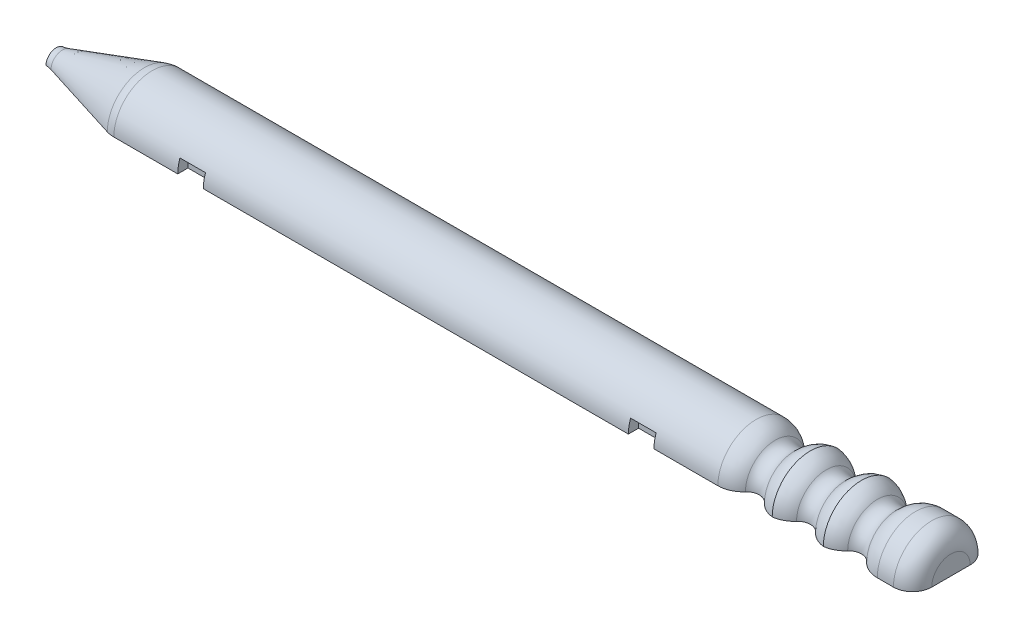
ISO-10303-21;
HEADER;
FILE_DESCRIPTION(('STEP AP214'),'2;1');
FILE_NAME('part.step','',(''),(''),'','','');
FILE_SCHEMA(('AUTOMOTIVE_DESIGN { 1 0 10303 214 1 1 1 1 }'));
ENDSEC;
DATA;
#1=APPLICATION_CONTEXT('core data for automotive mechanical design processes');
#2=APPLICATION_PROTOCOL_DEFINITION('international standard','automotive_design',2000,#1);
#3=PRODUCT_CONTEXT('',#1,'mechanical');
#4=PRODUCT('Part','Part','',(#3));
#5=PRODUCT_RELATED_PRODUCT_CATEGORY('part','',(#4));
#6=PRODUCT_DEFINITION_FORMATION('','',#4);
#7=PRODUCT_DEFINITION_CONTEXT('part definition',#1,'design');
#8=PRODUCT_DEFINITION('design','',#6,#7);
#9=PRODUCT_DEFINITION_SHAPE('','',#8);
#10=(LENGTH_UNIT() NAMED_UNIT(*) SI_UNIT(.MILLI.,.METRE.));
#11=(NAMED_UNIT(*) PLANE_ANGLE_UNIT() SI_UNIT($,.RADIAN.));
#12=(NAMED_UNIT(*) SI_UNIT($,.STERADIAN.) SOLID_ANGLE_UNIT());
#13=UNCERTAINTY_MEASURE_WITH_UNIT(LENGTH_MEASURE(1.E-05),#10,'distance_accuracy_value','');
#14=(GEOMETRIC_REPRESENTATION_CONTEXT(3) GLOBAL_UNCERTAINTY_ASSIGNED_CONTEXT((#13)) GLOBAL_UNIT_ASSIGNED_CONTEXT((#10,
#11,#12)) REPRESENTATION_CONTEXT('',''));
#15=CARTESIAN_POINT('',(0.,0.,0.));
#16=DIRECTION('',(0.,0.,1.));
#17=DIRECTION('',(1.,0.,0.));
#18=AXIS2_PLACEMENT_3D('',#15,#16,#17);
#19=CARTESIAN_POINT('',(0.,0.,1.49999999999999));
#20=DIRECTION('',(-1.,0.,0.));
#21=DIRECTION('',(0.,0.,1.));
#22=AXIS2_PLACEMENT_3D('',#19,#20,#21);
#23=PLANE('',#22);
#24=CARTESIAN_POINT('',(0.,0.,0.));
#25=DIRECTION('',(-1.,0.,0.));
#26=DIRECTION('',(0.,0.,1.));
#27=AXIS2_PLACEMENT_3D('',#24,#25,#26);
#28=CIRCLE('',#27,1.49999999999999);
#29=CARTESIAN_POINT('',(0.,0.,1.49999999999999));
#30=VERTEX_POINT('',#29);
#31=CARTESIAN_POINT('',(0.,0.,-1.49999999999999));
#32=VERTEX_POINT('',#31);
#33=EDGE_CURVE('E465',#30,#32,#28,.T.);
#34=ORIENTED_EDGE('',*,*,#33,.F.);
#35=DIRECTION('',(0.,0.,1.));
#36=VECTOR('',#35,1.);
#37=CARTESIAN_POINT('',(0.,0.,1.49999999999999));
#38=LINE('',#37,#36);
#39=EDGE_CURVE('E276',#32,#30,#38,.T.);
#40=ORIENTED_EDGE('',*,*,#39,.F.);
#41=EDGE_LOOP('',(#34,#40));
#42=FACE_BOUND('',#41,.T.);
#43=ADVANCED_FACE('F37',(#42),#23,.F.);
#44=CARTESIAN_POINT('',(-1.5,0.,0.));
#45=DIRECTION('',(-1.,0.,0.));
#46=DIRECTION('',(0.,0.,1.));
#47=AXIS2_PLACEMENT_3D('',#44,#45,#46);
#48=TOROIDAL_SURFACE('',#47,1.5,1.5);
#49=CARTESIAN_POINT('',(-1.50000000000001,0.,0.));
#50=DIRECTION('',(-1.,0.,0.));
#51=DIRECTION('',(0.,0.,1.));
#52=AXIS2_PLACEMENT_3D('',#49,#50,#51);
#53=CIRCLE('',#52,3.);
#54=CARTESIAN_POINT('',(-1.50000000000001,0.,3.));
#55=VERTEX_POINT('',#54);
#56=CARTESIAN_POINT('',(-1.50000000000001,0.,-3.));
#57=VERTEX_POINT('',#56);
#58=EDGE_CURVE('E468',#55,#57,#53,.T.);
#59=ORIENTED_EDGE('',*,*,#58,.F.);
#60=CARTESIAN_POINT('',(-1.5,0.,1.5));
#61=DIRECTION('',(0.,-1.,0.));
#62=DIRECTION('',(0.,0.,1.));
#63=AXIS2_PLACEMENT_3D('',#60,#61,#62);
#64=CIRCLE('',#63,1.5);
#65=EDGE_CURVE('E496',#30,#55,#64,.T.);
#66=ORIENTED_EDGE('',*,*,#65,.F.);
#67=ORIENTED_EDGE('',*,*,#33,.T.);
#68=CARTESIAN_POINT('',(-1.5,0.,-1.5));
#69=DIRECTION('',(0.,1.,0.));
#70=DIRECTION('',(0.,0.,-1.));
#71=AXIS2_PLACEMENT_3D('',#68,#69,#70);
#72=CIRCLE('',#71,1.5);
#73=EDGE_CURVE('E299',#32,#57,#72,.T.);
#74=ORIENTED_EDGE('',*,*,#73,.T.);
#75=EDGE_LOOP('',(#59,#66,#67,#74));
#76=FACE_BOUND('',#75,.T.);
#77=ADVANCED_FACE('F506',(#76),#48,.T.);
#78=CARTESIAN_POINT('',(0.,0.,0.));
#79=DIRECTION('',(-1.,0.,0.));
#80=DIRECTION('',(0.,0.,1.));
#81=AXIS2_PLACEMENT_3D('',#78,#79,#80);
#82=CYLINDRICAL_SURFACE('',#81,3.);
#83=DIRECTION('',(-1.,0.,0.));
#84=VECTOR('',#83,1.);
#85=CARTESIAN_POINT('',(-4.,0.,-3.));
#86=LINE('',#85,#84);
#87=CARTESIAN_POINT('',(-2.76393202250021,0.,-3.));
#88=VERTEX_POINT('',#87);
#89=EDGE_CURVE('E296',#57,#88,#86,.T.);
#90=ORIENTED_EDGE('',*,*,#89,.T.);
#91=CARTESIAN_POINT('',(-2.76393202250021,0.,0.));
#92=DIRECTION('',(1.,0.,0.));
#93=DIRECTION('',(0.,0.,-1.));
#94=AXIS2_PLACEMENT_3D('',#91,#92,#93);
#95=CIRCLE('',#94,3.);
#96=CARTESIAN_POINT('',(-2.76393202250021,0.,3.));
#97=VERTEX_POINT('',#96);
#98=EDGE_CURVE('E421',#88,#97,#95,.T.);
#99=ORIENTED_EDGE('',*,*,#98,.T.);
#100=DIRECTION('',(-1.,0.,0.));
#101=VECTOR('',#100,1.);
#102=CARTESIAN_POINT('',(-4.,0.,3.));
#103=LINE('',#102,#101);
#104=EDGE_CURVE('E493',#55,#97,#103,.T.);
#105=ORIENTED_EDGE('',*,*,#104,.F.);
#106=ORIENTED_EDGE('',*,*,#58,.T.);
#107=EDGE_LOOP('',(#90,#99,#105,#106));
#108=FACE_BOUND('',#107,.T.);
#109=ADVANCED_FACE('F508',(#108),#82,.T.);
#110=CARTESIAN_POINT('',(-5.,0.,0.));
#111=DIRECTION('',(-1.,0.,0.));
#112=DIRECTION('',(0.,0.,1.));
#113=AXIS2_PLACEMENT_3D('',#110,#111,#112);
#114=TOROIDAL_SURFACE('',#113,3.,1.);
#115=CARTESIAN_POINT('',(-5.,0.,3.));
#116=DIRECTION('',(0.,1.,0.));
#117=DIRECTION('',(0.,0.,-1.));
#118=AXIS2_PLACEMENT_3D('',#115,#116,#117);
#119=CIRCLE('',#118,1.);
#120=CARTESIAN_POINT('',(-4.25464400750007,0.,2.33333333333333));
#121=VERTEX_POINT('',#120);
#122=CARTESIAN_POINT('',(-5.74535599249993,0.,2.33333333333333));
#123=VERTEX_POINT('',#122);
#124=EDGE_CURVE('E490',#121,#123,#119,.T.);
#125=ORIENTED_EDGE('',*,*,#124,.F.);
#126=CARTESIAN_POINT('',(-4.25464400750007,0.,0.));
#127=DIRECTION('',(-1.,0.,0.));
#128=DIRECTION('',(0.,0.,1.));
#129=AXIS2_PLACEMENT_3D('',#126,#127,#128);
#130=CIRCLE('',#129,2.33333333333333);
#131=CARTESIAN_POINT('',(-4.25464400750007,0.,-2.33333333333333));
#132=VERTEX_POINT('',#131);
#133=EDGE_CURVE('E423',#121,#132,#130,.T.);
#134=ORIENTED_EDGE('',*,*,#133,.T.);
#135=CARTESIAN_POINT('',(-5.,0.,-3.));
#136=DIRECTION('',(0.,-1.,0.));
#137=DIRECTION('',(0.,0.,1.));
#138=AXIS2_PLACEMENT_3D('',#135,#136,#137);
#139=CIRCLE('',#138,1.);
#140=CARTESIAN_POINT('',(-5.74535599249993,0.,-2.33333333333333));
#141=VERTEX_POINT('',#140);
#142=EDGE_CURVE('E291',#132,#141,#139,.T.);
#143=ORIENTED_EDGE('',*,*,#142,.T.);
#144=CARTESIAN_POINT('',(-5.74535599249993,0.,0.));
#145=DIRECTION('',(1.,0.,0.));
#146=DIRECTION('',(0.,0.,-1.));
#147=AXIS2_PLACEMENT_3D('',#144,#145,#146);
#148=CIRCLE('',#147,2.33333333333333);
#149=EDGE_CURVE('E426',#141,#123,#148,.T.);
#150=ORIENTED_EDGE('',*,*,#149,.T.);
#151=EDGE_LOOP('',(#125,#134,#143,#150));
#152=FACE_BOUND('',#151,.T.);
#153=ADVANCED_FACE('F517',(#152),#114,.F.);
#154=CARTESIAN_POINT('',(-9.,0.,0.));
#155=DIRECTION('',(-1.,0.,0.));
#156=DIRECTION('',(0.,0.,1.));
#157=AXIS2_PLACEMENT_3D('',#154,#155,#156);
#158=TOROIDAL_SURFACE('',#157,3.,1.);
#159=CARTESIAN_POINT('',(-9.,0.,3.));
#160=DIRECTION('',(0.,1.,0.));
#161=DIRECTION('',(0.,0.,-1.));
#162=AXIS2_PLACEMENT_3D('',#159,#160,#161);
#163=CIRCLE('',#162,1.);
#164=CARTESIAN_POINT('',(-8.25464400750007,0.,2.33333333333333));
#165=VERTEX_POINT('',#164);
#166=CARTESIAN_POINT('',(-9.74535599249993,0.,2.33333333333333));
#167=VERTEX_POINT('',#166);
#168=EDGE_CURVE('E487',#165,#167,#163,.T.);
#169=ORIENTED_EDGE('',*,*,#168,.F.);
#170=CARTESIAN_POINT('',(-8.25464400750007,0.,0.));
#171=DIRECTION('',(-1.,0.,0.));
#172=DIRECTION('',(0.,0.,1.));
#173=AXIS2_PLACEMENT_3D('',#170,#171,#172);
#174=CIRCLE('',#173,2.33333333333333);
#175=CARTESIAN_POINT('',(-8.25464400750007,0.,-2.33333333333333));
#176=VERTEX_POINT('',#175);
#177=EDGE_CURVE('E416',#165,#176,#174,.T.);
#178=ORIENTED_EDGE('',*,*,#177,.T.);
#179=CARTESIAN_POINT('',(-9.,0.,-3.));
#180=DIRECTION('',(0.,-1.,0.));
#181=DIRECTION('',(0.,0.,1.));
#182=AXIS2_PLACEMENT_3D('',#179,#180,#181);
#183=CIRCLE('',#182,1.);
#184=CARTESIAN_POINT('',(-9.74535599249993,0.,-2.33333333333333));
#185=VERTEX_POINT('',#184);
#186=EDGE_CURVE('E286',#176,#185,#183,.T.);
#187=ORIENTED_EDGE('',*,*,#186,.T.);
#188=CARTESIAN_POINT('',(-9.74535599249993,0.,0.));
#189=DIRECTION('',(1.,0.,0.));
#190=DIRECTION('',(0.,0.,-1.));
#191=AXIS2_PLACEMENT_3D('',#188,#189,#190);
#192=CIRCLE('',#191,2.33333333333333);
#193=EDGE_CURVE('E418',#185,#167,#192,.T.);
#194=ORIENTED_EDGE('',*,*,#193,.T.);
#195=EDGE_LOOP('',(#169,#178,#187,#194));
#196=FACE_BOUND('',#195,.T.);
#197=ADVANCED_FACE('F531',(#196),#158,.F.);
#198=CARTESIAN_POINT('',(-13.,0.,0.));
#199=DIRECTION('',(-1.,0.,0.));
#200=DIRECTION('',(0.,0.,1.));
#201=AXIS2_PLACEMENT_3D('',#198,#199,#200);
#202=TOROIDAL_SURFACE('',#201,3.,1.);
#203=CARTESIAN_POINT('',(-13.,0.,3.));
#204=DIRECTION('',(0.,1.,0.));
#205=DIRECTION('',(0.,0.,-1.));
#206=AXIS2_PLACEMENT_3D('',#203,#204,#205);
#207=CIRCLE('',#206,1.);
#208=CARTESIAN_POINT('',(-12.2546440075001,0.,2.33333333333333));
#209=VERTEX_POINT('',#208);
#210=CARTESIAN_POINT('',(-13.7453559924999,0.,2.33333333333333));
#211=VERTEX_POINT('',#210);
#212=EDGE_CURVE('E484',#209,#211,#207,.T.);
#213=ORIENTED_EDGE('',*,*,#212,.F.);
#214=CARTESIAN_POINT('',(-12.2546440075001,0.,0.));
#215=DIRECTION('',(-1.,0.,0.));
#216=DIRECTION('',(0.,0.,1.));
#217=AXIS2_PLACEMENT_3D('',#214,#215,#216);
#218=CIRCLE('',#217,2.33333333333333);
#219=CARTESIAN_POINT('',(-12.2546440075001,0.,-2.33333333333333));
#220=VERTEX_POINT('',#219);
#221=EDGE_CURVE('E412',#209,#220,#218,.T.);
#222=ORIENTED_EDGE('',*,*,#221,.T.);
#223=CARTESIAN_POINT('',(-13.,0.,-3.));
#224=DIRECTION('',(0.,-1.,0.));
#225=DIRECTION('',(0.,0.,1.));
#226=AXIS2_PLACEMENT_3D('',#223,#224,#225);
#227=CIRCLE('',#226,1.);
#228=CARTESIAN_POINT('',(-13.7453559924999,0.,-2.33333333333333));
#229=VERTEX_POINT('',#228);
#230=EDGE_CURVE('E280',#220,#229,#227,.T.);
#231=ORIENTED_EDGE('',*,*,#230,.T.);
#232=CARTESIAN_POINT('',(-13.7453559924999,0.,0.));
#233=DIRECTION('',(1.,0.,0.));
#234=DIRECTION('',(0.,0.,-1.));
#235=AXIS2_PLACEMENT_3D('',#232,#233,#234);
#236=CIRCLE('',#235,2.33333333333333);
#237=EDGE_CURVE('E414',#229,#211,#236,.T.);
#238=ORIENTED_EDGE('',*,*,#237,.T.);
#239=EDGE_LOOP('',(#213,#222,#231,#238));
#240=FACE_BOUND('',#239,.T.);
#241=ADVANCED_FACE('F543',(#240),#202,.F.);
#242=CARTESIAN_POINT('',(0.,0.,0.));
#243=DIRECTION('',(-1.,0.,0.));
#244=DIRECTION('',(0.,0.,1.));
#245=AXIS2_PLACEMENT_3D('',#242,#243,#244);
#246=CYLINDRICAL_SURFACE('',#245,3.);
#247=DIRECTION('',(-1.,0.,0.));
#248=VECTOR('',#247,1.);
#249=CARTESIAN_POINT('',(-62.8,0.,3.));
#250=LINE('',#249,#248);
#251=CARTESIAN_POINT('',(-57.4931140626021,0.,3.));
#252=VERTEX_POINT('',#251);
#253=CARTESIAN_POINT('',(-62.4931140626021,0.,3.));
#254=VERTEX_POINT('',#253);
#255=EDGE_CURVE('E483',#252,#254,#250,.T.);
#256=ORIENTED_EDGE('',*,*,#255,.F.);
#257=CARTESIAN_POINT('',(-57.4931140626021,0.,0.));
#258=DIRECTION('',(-1.,0.,0.));
#259=DIRECTION('',(0.,0.,1.));
#260=AXIS2_PLACEMENT_3D('',#257,#258,#259);
#261=CIRCLE('',#260,3.);
#262=CARTESIAN_POINT('',(-57.4931140626021,0.99999999999998,2.8284271247462));
#263=VERTEX_POINT('',#262);
#264=EDGE_CURVE('E303',#252,#263,#261,.T.);
#265=ORIENTED_EDGE('',*,*,#264,.T.);
#266=DIRECTION('',(-1.,0.,0.));
#267=VECTOR('',#266,1.);
#268=CARTESIAN_POINT('',(0.,0.99999999999998,2.8284271247462));
#269=LINE('',#268,#267);
#270=CARTESIAN_POINT('',(-55.4931140626021,0.99999999999998,2.8284271247462));
#271=VERTEX_POINT('',#270);
#272=EDGE_CURVE('E11',#271,#263,#269,.T.);
#273=ORIENTED_EDGE('',*,*,#272,.F.);
#274=CARTESIAN_POINT('',(-55.4931140626021,0.,0.));
#275=DIRECTION('',(1.,0.,0.));
#276=DIRECTION('',(0.,0.,-1.));
#277=AXIS2_PLACEMENT_3D('',#274,#275,#276);
#278=CIRCLE('',#277,3.);
#279=CARTESIAN_POINT('',(-55.4931140626021,0.,3.));
#280=VERTEX_POINT('',#279);
#281=EDGE_CURVE('E307',#271,#280,#278,.T.);
#282=ORIENTED_EDGE('',*,*,#281,.T.);
#283=CARTESIAN_POINT('',(-22.2360679774998,0.,3.));
#284=VERTEX_POINT('',#283);
#285=EDGE_CURVE('E482',#284,#280,#250,.T.);
#286=ORIENTED_EDGE('',*,*,#285,.F.);
#287=CARTESIAN_POINT('',(-22.2360679774998,0.,0.));
#288=DIRECTION('',(-1.,0.,0.));
#289=DIRECTION('',(0.,0.,1.));
#290=AXIS2_PLACEMENT_3D('',#287,#288,#289);
#291=CIRCLE('',#290,3.);
#292=CARTESIAN_POINT('',(-22.2360679774998,0.99999999999998,2.8284271247462));
#293=VERTEX_POINT('',#292);
#294=EDGE_CURVE('E252',#284,#293,#291,.T.);
#295=ORIENTED_EDGE('',*,*,#294,.T.);
#296=DIRECTION('',(-1.,0.,0.));
#297=VECTOR('',#296,1.);
#298=CARTESIAN_POINT('',(0.,0.99999999999998,2.8284271247462));
#299=LINE('',#298,#297);
#300=CARTESIAN_POINT('',(-20.2360679774998,0.99999999999998,2.8284271247462));
#301=VERTEX_POINT('',#300);
#302=EDGE_CURVE('E45',#301,#293,#299,.T.);
#303=ORIENTED_EDGE('',*,*,#302,.F.);
#304=CARTESIAN_POINT('',(-20.2360679774998,0.,0.));
#305=DIRECTION('',(1.,0.,0.));
#306=DIRECTION('',(0.,0.,-1.));
#307=AXIS2_PLACEMENT_3D('',#304,#305,#306);
#308=CIRCLE('',#307,3.);
#309=CARTESIAN_POINT('',(-20.2360679774998,0.,3.));
#310=VERTEX_POINT('',#309);
#311=EDGE_CURVE('E310',#301,#310,#308,.T.);
#312=ORIENTED_EDGE('',*,*,#311,.T.);
#313=CARTESIAN_POINT('',(-15.2360679774998,0.,3.));
#314=VERTEX_POINT('',#313);
#315=EDGE_CURVE('E479',#314,#310,#250,.T.);
#316=ORIENTED_EDGE('',*,*,#315,.F.);
#317=CARTESIAN_POINT('',(-15.2360679774998,0.,0.));
#318=DIRECTION('',(1.,0.,0.));
#319=DIRECTION('',(0.,0.,-1.));
#320=AXIS2_PLACEMENT_3D('',#317,#318,#319);
#321=CIRCLE('',#320,3.);
#322=CARTESIAN_POINT('',(-15.2360679774998,0.,-3.));
#323=VERTEX_POINT('',#322);
#324=EDGE_CURVE('E270',#314,#323,#321,.F.);
#325=ORIENTED_EDGE('',*,*,#324,.T.);
#326=DIRECTION('',(-1.,0.,0.));
#327=VECTOR('',#326,1.);
#328=CARTESIAN_POINT('',(-62.8,0.,-3.));
#329=LINE('',#328,#327);
#330=CARTESIAN_POINT('',(-20.2360679774998,0.,-3.));
#331=VERTEX_POINT('',#330);
#332=EDGE_CURVE('E259',#323,#331,#329,.T.);
#333=ORIENTED_EDGE('',*,*,#332,.T.);
#334=CARTESIAN_POINT('',(-20.2360679774998,0.,0.));
#335=DIRECTION('',(1.,0.,0.));
#336=DIRECTION('',(0.,0.,-1.));
#337=AXIS2_PLACEMENT_3D('',#334,#335,#336);
#338=CIRCLE('',#337,3.);
#339=CARTESIAN_POINT('',(-20.2360679774998,1.00000000000002,-2.82842712474618));
#340=VERTEX_POINT('',#339);
#341=EDGE_CURVE('E246',#331,#340,#338,.T.);
#342=ORIENTED_EDGE('',*,*,#341,.T.);
#343=DIRECTION('',(-1.,0.,0.));
#344=VECTOR('',#343,1.);
#345=CARTESIAN_POINT('',(0.,1.00000000000002,-2.82842712474618));
#346=LINE('',#345,#344);
#347=CARTESIAN_POINT('',(-22.2360679774998,1.00000000000002,-2.82842712474618));
#348=VERTEX_POINT('',#347);
#349=EDGE_CURVE('E398',#348,#340,#346,.F.);
#350=ORIENTED_EDGE('',*,*,#349,.F.);
#351=CARTESIAN_POINT('',(-22.2360679774998,0.,0.));
#352=DIRECTION('',(-1.,0.,0.));
#353=DIRECTION('',(0.,0.,1.));
#354=AXIS2_PLACEMENT_3D('',#351,#352,#353);
#355=CIRCLE('',#354,3.);
#356=CARTESIAN_POINT('',(-22.2360679774998,0.,-3.));
#357=VERTEX_POINT('',#356);
#358=EDGE_CURVE('E253',#348,#357,#355,.T.);
#359=ORIENTED_EDGE('',*,*,#358,.T.);
#360=CARTESIAN_POINT('',(-55.4931140626021,0.,-3.));
#361=VERTEX_POINT('',#360);
#362=EDGE_CURVE('E272',#357,#361,#329,.T.);
#363=ORIENTED_EDGE('',*,*,#362,.T.);
#364=CARTESIAN_POINT('',(-55.4931140626021,0.,0.));
#365=DIRECTION('',(1.,0.,0.));
#366=DIRECTION('',(0.,0.,-1.));
#367=AXIS2_PLACEMENT_3D('',#364,#365,#366);
#368=CIRCLE('',#367,3.);
#369=CARTESIAN_POINT('',(-55.4931140626021,1.00000000000002,-2.82842712474618));
#370=VERTEX_POINT('',#369);
#371=EDGE_CURVE('E319',#361,#370,#368,.T.);
#372=ORIENTED_EDGE('',*,*,#371,.T.);
#373=DIRECTION('',(-1.,0.,0.));
#374=VECTOR('',#373,1.);
#375=CARTESIAN_POINT('',(0.,1.00000000000002,-2.82842712474618));
#376=LINE('',#375,#374);
#377=CARTESIAN_POINT('',(-57.4931140626021,1.00000000000002,-2.82842712474618));
#378=VERTEX_POINT('',#377);
#379=EDGE_CURVE('E399',#370,#378,#376,.T.);
#380=ORIENTED_EDGE('',*,*,#379,.T.);
#381=CARTESIAN_POINT('',(-57.4931140626021,0.,0.));
#382=DIRECTION('',(-1.,0.,0.));
#383=DIRECTION('',(0.,0.,1.));
#384=AXIS2_PLACEMENT_3D('',#381,#382,#383);
#385=CIRCLE('',#384,3.);
#386=CARTESIAN_POINT('',(-57.4931140626021,0.,-3.00000000000001));
#387=VERTEX_POINT('',#386);
#388=EDGE_CURVE('E317',#378,#387,#385,.T.);
#389=ORIENTED_EDGE('',*,*,#388,.T.);
#390=CARTESIAN_POINT('',(-62.4931140626021,0.,-3.));
#391=VERTEX_POINT('',#390);
#392=EDGE_CURVE('E274',#387,#391,#329,.T.);
#393=ORIENTED_EDGE('',*,*,#392,.T.);
#394=CARTESIAN_POINT('',(-62.4931140626021,0.,0.));
#395=DIRECTION('',(1.,0.,0.));
#396=DIRECTION('',(0.,0.,-1.));
#397=AXIS2_PLACEMENT_3D('',#394,#395,#396);
#398=CIRCLE('',#397,3.);
#399=EDGE_CURVE('E429',#391,#254,#398,.T.);
#400=ORIENTED_EDGE('',*,*,#399,.T.);
#401=EDGE_LOOP('',(#256,#265,#273,#282,#286,#295,#303,#312,#316,#325,#333,#342,#350,#359,#363,
#372,#380,#389,#393,#400));
#402=FACE_BOUND('',#401,.T.);
#403=ADVANCED_FACE('F267',(#402),#246,.T.);
#404=CARTESIAN_POINT('',(-62.8,0.,0.));
#405=DIRECTION('',(1.,0.,0.));
#406=DIRECTION('',(0.,0.,-1.));
#407=AXIS2_PLACEMENT_3D('',#404,#405,#406);
#408=CONICAL_SURFACE('',#407,3.,0.304510883202114);
#409=DIRECTION('',(-0.953993716901255,0.,0.299826596740396));
#410=VECTOR('',#409,1.);
#411=CARTESIAN_POINT('',(-69.8,0.,-0.799999999999991));
#412=LINE('',#411,#410);
#413=CARTESIAN_POINT('',(-63.0927672560829,0.,-2.90798743380251));
#414=VERTEX_POINT('',#413);
#415=CARTESIAN_POINT('',(-69.518311709439,0.,-0.888530605604876));
#416=VERTEX_POINT('',#415);
#417=EDGE_CURVE('E271',#414,#416,#412,.T.);
#418=ORIENTED_EDGE('',*,*,#417,.T.);
#419=CARTESIAN_POINT('',(-69.518311709439,0.,0.));
#420=DIRECTION('',(-1.,0.,0.));
#421=DIRECTION('',(0.,0.,1.));
#422=AXIS2_PLACEMENT_3D('',#419,#420,#421);
#423=CIRCLE('',#422,0.888530605604876);
#424=CARTESIAN_POINT('',(-69.518311709439,0.,0.888530605604876));
#425=VERTEX_POINT('',#424);
#426=EDGE_CURVE('E460',#416,#425,#423,.F.);
#427=ORIENTED_EDGE('',*,*,#426,.T.);
#428=DIRECTION('',(-0.953993716901255,0.,-0.299826596740396));
#429=VECTOR('',#428,1.);
#430=CARTESIAN_POINT('',(-69.8,0.,0.799999999999991));
#431=LINE('',#430,#429);
#432=CARTESIAN_POINT('',(-63.0927672560829,0.,2.90798743380251));
#433=VERTEX_POINT('',#432);
#434=EDGE_CURVE('E476',#433,#425,#431,.T.);
#435=ORIENTED_EDGE('',*,*,#434,.F.);
#436=CARTESIAN_POINT('',(-63.0927672560829,0.,0.));
#437=DIRECTION('',(-1.,0.,0.));
#438=DIRECTION('',(0.,0.,1.));
#439=AXIS2_PLACEMENT_3D('',#436,#437,#438);
#440=CIRCLE('',#439,2.90798743380251);
#441=EDGE_CURVE('E462',#433,#414,#440,.T.);
#442=ORIENTED_EDGE('',*,*,#441,.T.);
#443=EDGE_LOOP('',(#418,#427,#435,#442));
#444=FACE_BOUND('',#443,.T.);
#445=ADVANCED_FACE('F574',(#444),#408,.T.);
#446=CARTESIAN_POINT('',(-70.,0.,0.));
#447=DIRECTION('',(1.,0.,0.));
#448=DIRECTION('',(0.,0.,-1.));
#449=AXIS2_PLACEMENT_3D('',#446,#447,#448);
#450=PLANE('',#449);
#451=CARTESIAN_POINT('',(-70.,0.,0.));
#452=DIRECTION('',(-1.,0.,0.));
#453=DIRECTION('',(0.,0.,1.));
#454=AXIS2_PLACEMENT_3D('',#451,#452,#453);
#455=CIRCLE('',#454,0.799999999999991);
#456=CARTESIAN_POINT('',(-70.,0.,0.799999999999991));
#457=VERTEX_POINT('',#456);
#458=CARTESIAN_POINT('',(-70.,0.,-0.799999999999991));
#459=VERTEX_POINT('',#458);
#460=EDGE_CURVE('E470',#457,#459,#455,.T.);
#461=ORIENTED_EDGE('',*,*,#460,.T.);
#462=DIRECTION('',(0.,0.,-1.));
#463=VECTOR('',#462,1.);
#464=CARTESIAN_POINT('',(-70.,0.,0.));
#465=LINE('',#464,#463);
#466=EDGE_CURVE('E473',#457,#459,#465,.T.);
#467=ORIENTED_EDGE('',*,*,#466,.F.);
#468=EDGE_LOOP('',(#461,#467));
#469=FACE_BOUND('',#468,.T.);
#470=ADVANCED_FACE('F582',(#469),#450,.F.);
#471=CARTESIAN_POINT('',(-13.,0.,3.));
#472=DIRECTION('',(0.,-1.,0.));
#473=DIRECTION('',(0.,0.,-1.));
#474=AXIS2_PLACEMENT_3D('',#471,#472,#473);
#475=PLANE('',#474);
#476=DIRECTION('',(0.,0.,-1.));
#477=VECTOR('',#476,1.);
#478=CARTESIAN_POINT('',(-57.4931140626021,0.,3.));
#479=LINE('',#478,#477);
#480=CARTESIAN_POINT('',(-57.4931140626021,0.,2.2));
#481=VERTEX_POINT('',#480);
#482=EDGE_CURVE('E52',#252,#481,#479,.T.);
#483=ORIENTED_EDGE('',*,*,#482,.F.);
#484=ORIENTED_EDGE('',*,*,#255,.T.);
#485=CARTESIAN_POINT('',(-62.4931140626021,0.,1.));
#486=DIRECTION('',(0.,-1.,0.));
#487=DIRECTION('',(0.,0.,-1.));
#488=AXIS2_PLACEMENT_3D('',#485,#486,#487);
#489=CIRCLE('',#488,2.);
#490=EDGE_CURVE('E434',#254,#433,#489,.T.);
#491=ORIENTED_EDGE('',*,*,#490,.T.);
#492=ORIENTED_EDGE('',*,*,#434,.T.);
#493=CARTESIAN_POINT('',(-70.1179649029198,0.,2.79651803940739));
#494=DIRECTION('',(0.,-1.,0.));
#495=DIRECTION('',(0.,0.,-1.));
#496=AXIS2_PLACEMENT_3D('',#493,#494,#495);
#497=CIRCLE('',#496,2.);
#498=EDGE_CURVE('E402',#425,#457,#497,.F.);
#499=ORIENTED_EDGE('',*,*,#498,.T.);
#500=ORIENTED_EDGE('',*,*,#466,.T.);
#501=CARTESIAN_POINT('',(-70.1179649029198,0.,-2.79651803940739));
#502=DIRECTION('',(0.,-1.,0.));
#503=DIRECTION('',(0.,0.,-1.));
#504=AXIS2_PLACEMENT_3D('',#501,#502,#503);
#505=CIRCLE('',#504,2.);
#506=EDGE_CURVE('E410',#459,#416,#505,.F.);
#507=ORIENTED_EDGE('',*,*,#506,.T.);
#508=ORIENTED_EDGE('',*,*,#417,.F.);
#509=CARTESIAN_POINT('',(-62.4931140626021,0.,-1.));
#510=DIRECTION('',(0.,-1.,0.));
#511=DIRECTION('',(0.,0.,-1.));
#512=AXIS2_PLACEMENT_3D('',#509,#510,#511);
#513=CIRCLE('',#512,2.);
#514=EDGE_CURVE('E432',#414,#391,#513,.T.);
#515=ORIENTED_EDGE('',*,*,#514,.T.);
#516=ORIENTED_EDGE('',*,*,#392,.F.);
#517=DIRECTION('',(0.,0.,-1.));
#518=VECTOR('',#517,1.);
#519=CARTESIAN_POINT('',(-57.4931140626021,0.,-3.00000000000001));
#520=LINE('',#519,#518);
#521=CARTESIAN_POINT('',(-57.4931140626021,0.,-2.20000000000001));
#522=VERTEX_POINT('',#521);
#523=EDGE_CURVE('E263',#522,#387,#520,.T.);
#524=ORIENTED_EDGE('',*,*,#523,.F.);
#525=DIRECTION('',(-1.,0.,0.));
#526=VECTOR('',#525,1.);
#527=CARTESIAN_POINT('',(-57.4931140626021,0.,-2.20000000000001));
#528=LINE('',#527,#526);
#529=CARTESIAN_POINT('',(-55.4931140626021,0.,-2.20000000000001));
#530=VERTEX_POINT('',#529);
#531=EDGE_CURVE('E327',#530,#522,#528,.T.);
#532=ORIENTED_EDGE('',*,*,#531,.F.);
#533=DIRECTION('',(0.,0.,1.));
#534=VECTOR('',#533,1.);
#535=CARTESIAN_POINT('',(-55.4931140626021,0.,-3.00000000000001));
#536=LINE('',#535,#534);
#537=EDGE_CURVE('E331',#361,#530,#536,.T.);
#538=ORIENTED_EDGE('',*,*,#537,.F.);
#539=ORIENTED_EDGE('',*,*,#362,.F.);
#540=DIRECTION('',(0.,0.,-1.));
#541=VECTOR('',#540,1.);
#542=CARTESIAN_POINT('',(-22.2360679774998,0.,-3.));
#543=LINE('',#542,#541);
#544=CARTESIAN_POINT('',(-22.2360679774998,0.,-2.2));
#545=VERTEX_POINT('',#544);
#546=EDGE_CURVE('E381',#545,#357,#543,.T.);
#547=ORIENTED_EDGE('',*,*,#546,.F.);
#548=DIRECTION('',(-1.,0.,0.));
#549=VECTOR('',#548,1.);
#550=CARTESIAN_POINT('',(-20.2360679774998,0.,-2.2));
#551=LINE('',#550,#549);
#552=CARTESIAN_POINT('',(-20.2360679774998,0.,-2.2));
#553=VERTEX_POINT('',#552);
#554=EDGE_CURVE('E262',#553,#545,#551,.T.);
#555=ORIENTED_EDGE('',*,*,#554,.F.);
#556=DIRECTION('',(0.,0.,1.));
#557=VECTOR('',#556,1.);
#558=CARTESIAN_POINT('',(-20.2360679774998,0.,-3.));
#559=LINE('',#558,#557);
#560=EDGE_CURVE('E60',#331,#553,#559,.T.);
#561=ORIENTED_EDGE('',*,*,#560,.F.);
#562=ORIENTED_EDGE('',*,*,#332,.F.);
#563=CARTESIAN_POINT('',(-15.2360679774998,0.,-1.));
#564=DIRECTION('',(0.,-1.,0.));
#565=DIRECTION('',(0.,0.,-1.));
#566=AXIS2_PLACEMENT_3D('',#563,#564,#565);
#567=CIRCLE('',#566,2.);
#568=EDGE_CURVE('E456',#323,#229,#567,.T.);
#569=ORIENTED_EDGE('',*,*,#568,.T.);
#570=ORIENTED_EDGE('',*,*,#230,.F.);
#571=CARTESIAN_POINT('',(-10.7639320225002,0.,-1.));
#572=DIRECTION('',(0.,-1.,0.));
#573=DIRECTION('',(0.,0.,-1.));
#574=AXIS2_PLACEMENT_3D('',#571,#572,#573);
#575=CIRCLE('',#574,2.);
#576=CARTESIAN_POINT('',(-11.,0.,-2.98601911118679));
#577=VERTEX_POINT('',#576);
#578=EDGE_CURVE('E450',#220,#577,#575,.T.);
#579=ORIENTED_EDGE('',*,*,#578,.T.);
#580=CARTESIAN_POINT('',(-11.2360679774998,0.,-1.));
#581=DIRECTION('',(0.,-1.,0.));
#582=DIRECTION('',(0.,0.,-1.));
#583=AXIS2_PLACEMENT_3D('',#580,#581,#582);
#584=CIRCLE('',#583,2.);
#585=EDGE_CURVE('E448',#577,#185,#584,.T.);
#586=ORIENTED_EDGE('',*,*,#585,.T.);
#587=ORIENTED_EDGE('',*,*,#186,.F.);
#588=CARTESIAN_POINT('',(-6.76393202250021,0.,-1.));
#589=DIRECTION('',(0.,-1.,0.));
#590=DIRECTION('',(0.,0.,-1.));
#591=AXIS2_PLACEMENT_3D('',#588,#589,#590);
#592=CIRCLE('',#591,2.);
#593=CARTESIAN_POINT('',(-7.,0.,-2.98601911118679));
#594=VERTEX_POINT('',#593);
#595=EDGE_CURVE('E442',#176,#594,#592,.T.);
#596=ORIENTED_EDGE('',*,*,#595,.T.);
#597=CARTESIAN_POINT('',(-7.23606797749979,0.,-1.));
#598=DIRECTION('',(0.,-1.,0.));
#599=DIRECTION('',(0.,0.,-1.));
#600=AXIS2_PLACEMENT_3D('',#597,#598,#599);
#601=CIRCLE('',#600,2.);
#602=EDGE_CURVE('E440',#594,#141,#601,.T.);
#603=ORIENTED_EDGE('',*,*,#602,.T.);
#604=ORIENTED_EDGE('',*,*,#142,.F.);
#605=CARTESIAN_POINT('',(-2.76393202250021,0.,-1.));
#606=DIRECTION('',(0.,-1.,0.));
#607=DIRECTION('',(0.,0.,-1.));
#608=AXIS2_PLACEMENT_3D('',#605,#606,#607);
#609=CIRCLE('',#608,2.);
#610=EDGE_CURVE('E436',#132,#88,#609,.T.);
#611=ORIENTED_EDGE('',*,*,#610,.T.);
#612=ORIENTED_EDGE('',*,*,#89,.F.);
#613=ORIENTED_EDGE('',*,*,#73,.F.);
#614=ORIENTED_EDGE('',*,*,#39,.T.);
#615=ORIENTED_EDGE('',*,*,#65,.T.);
#616=ORIENTED_EDGE('',*,*,#104,.T.);
#617=CARTESIAN_POINT('',(-2.76393202250021,0.,1.));
#618=DIRECTION('',(0.,-1.,0.));
#619=DIRECTION('',(0.,0.,-1.));
#620=AXIS2_PLACEMENT_3D('',#617,#618,#619);
#621=CIRCLE('',#620,2.);
#622=EDGE_CURVE('E438',#97,#121,#621,.T.);
#623=ORIENTED_EDGE('',*,*,#622,.T.);
#624=ORIENTED_EDGE('',*,*,#124,.T.);
#625=CARTESIAN_POINT('',(-7.23606797749979,0.,1.));
#626=DIRECTION('',(0.,-1.,0.));
#627=DIRECTION('',(0.,0.,-1.));
#628=AXIS2_PLACEMENT_3D('',#625,#626,#627);
#629=CIRCLE('',#628,2.);
#630=CARTESIAN_POINT('',(-7.,0.,2.98601911118679));
#631=VERTEX_POINT('',#630);
#632=EDGE_CURVE('E444',#123,#631,#629,.T.);
#633=ORIENTED_EDGE('',*,*,#632,.T.);
#634=CARTESIAN_POINT('',(-6.76393202250021,0.,1.));
#635=DIRECTION('',(0.,-1.,0.));
#636=DIRECTION('',(0.,0.,-1.));
#637=AXIS2_PLACEMENT_3D('',#634,#635,#636);
#638=CIRCLE('',#637,2.);
#639=EDGE_CURVE('E446',#631,#165,#638,.T.);
#640=ORIENTED_EDGE('',*,*,#639,.T.);
#641=ORIENTED_EDGE('',*,*,#168,.T.);
#642=CARTESIAN_POINT('',(-11.2360679774998,0.,1.));
#643=DIRECTION('',(0.,-1.,0.));
#644=DIRECTION('',(0.,0.,-1.));
#645=AXIS2_PLACEMENT_3D('',#642,#643,#644);
#646=CIRCLE('',#645,2.);
#647=CARTESIAN_POINT('',(-11.,0.,2.98601911118679));
#648=VERTEX_POINT('',#647);
#649=EDGE_CURVE('E452',#167,#648,#646,.T.);
#650=ORIENTED_EDGE('',*,*,#649,.T.);
#651=CARTESIAN_POINT('',(-10.7639320225002,0.,1.));
#652=DIRECTION('',(0.,-1.,0.));
#653=DIRECTION('',(0.,0.,-1.));
#654=AXIS2_PLACEMENT_3D('',#651,#652,#653);
#655=CIRCLE('',#654,2.);
#656=EDGE_CURVE('E454',#648,#209,#655,.T.);
#657=ORIENTED_EDGE('',*,*,#656,.T.);
#658=ORIENTED_EDGE('',*,*,#212,.T.);
#659=CARTESIAN_POINT('',(-15.2360679774998,0.,1.));
#660=DIRECTION('',(0.,-1.,0.));
#661=DIRECTION('',(0.,0.,-1.));
#662=AXIS2_PLACEMENT_3D('',#659,#660,#661);
#663=CIRCLE('',#662,2.);
#664=EDGE_CURVE('E458',#211,#314,#663,.T.);
#665=ORIENTED_EDGE('',*,*,#664,.T.);
#666=ORIENTED_EDGE('',*,*,#315,.T.);
#667=DIRECTION('',(0.,0.,1.));
#668=VECTOR('',#667,1.);
#669=CARTESIAN_POINT('',(-20.2360679774998,0.,3.));
#670=LINE('',#669,#668);
#671=CARTESIAN_POINT('',(-20.2360679774998,0.,2.20000000000001));
#672=VERTEX_POINT('',#671);
#673=EDGE_CURVE('E362',#672,#310,#670,.T.);
#674=ORIENTED_EDGE('',*,*,#673,.F.);
#675=DIRECTION('',(1.,0.,0.));
#676=VECTOR('',#675,1.);
#677=CARTESIAN_POINT('',(-20.2360679774998,0.,2.20000000000001));
#678=LINE('',#677,#676);
#679=CARTESIAN_POINT('',(-22.2360679774998,0.,2.20000000000001));
#680=VERTEX_POINT('',#679);
#681=EDGE_CURVE('E374',#680,#672,#678,.T.);
#682=ORIENTED_EDGE('',*,*,#681,.F.);
#683=DIRECTION('',(0.,0.,-1.));
#684=VECTOR('',#683,1.);
#685=CARTESIAN_POINT('',(-22.2360679774998,0.,3.));
#686=LINE('',#685,#684);
#687=EDGE_CURVE('E370',#284,#680,#686,.T.);
#688=ORIENTED_EDGE('',*,*,#687,.F.);
#689=ORIENTED_EDGE('',*,*,#285,.T.);
#690=DIRECTION('',(0.,0.,1.));
#691=VECTOR('',#690,1.);
#692=CARTESIAN_POINT('',(-55.4931140626021,0.,3.));
#693=LINE('',#692,#691);
#694=CARTESIAN_POINT('',(-55.4931140626021,0.,2.2));
#695=VERTEX_POINT('',#694);
#696=EDGE_CURVE('E343',#695,#280,#693,.T.);
#697=ORIENTED_EDGE('',*,*,#696,.F.);
#698=DIRECTION('',(1.,0.,0.));
#699=VECTOR('',#698,1.);
#700=CARTESIAN_POINT('',(-57.4931140626021,0.,2.2));
#701=LINE('',#700,#699);
#702=EDGE_CURVE('E353',#481,#695,#701,.T.);
#703=ORIENTED_EDGE('',*,*,#702,.F.);
#704=EDGE_LOOP('',(#483,#484,#491,#492,#499,#500,#507,#508,#515,#516,#524,#532,#538,#539,#547,
#555,#561,#562,#569,#570,#579,#586,#587,#596,#603,#604,#611,#612,#613,#614,#615,#616,#623,#624,
#633,#640,#641,#650,#657,#658,#665,#666,#674,#682,#688,#689,#697,#703));
#705=FACE_BOUND('',#704,.T.);
#706=ADVANCED_FACE('F258',(#705),#475,.T.);
#707=CARTESIAN_POINT('',(-70.1179649029198,0.,0.));
#708=DIRECTION('',(-1.,0.,0.));
#709=DIRECTION('',(0.,0.,1.));
#710=AXIS2_PLACEMENT_3D('',#707,#708,#709);
#711=TOROIDAL_SURFACE('',#710,2.79651803940739,2.);
#712=ORIENTED_EDGE('',*,*,#498,.F.);
#713=ORIENTED_EDGE('',*,*,#426,.F.);
#714=ORIENTED_EDGE('',*,*,#506,.F.);
#715=ORIENTED_EDGE('',*,*,#460,.F.);
#716=EDGE_LOOP('',(#712,#713,#714,#715));
#717=FACE_BOUND('',#716,.T.);
#718=ADVANCED_FACE('F580',(#717),#711,.F.);
#719=CARTESIAN_POINT('',(-62.4931140626021,0.,0.));
#720=DIRECTION('',(1.,0.,0.));
#721=DIRECTION('',(0.,0.,-1.));
#722=AXIS2_PLACEMENT_3D('',#719,#720,#721);
#723=DEGENERATE_TOROIDAL_SURFACE('',#722,1.,2.,.T.);
#724=ORIENTED_EDGE('',*,*,#490,.F.);
#725=ORIENTED_EDGE('',*,*,#399,.F.);
#726=ORIENTED_EDGE('',*,*,#514,.F.);
#727=ORIENTED_EDGE('',*,*,#441,.F.);
#728=EDGE_LOOP('',(#724,#725,#726,#727));
#729=FACE_BOUND('',#728,.T.);
#730=ADVANCED_FACE('F571',(#729),#723,.T.);
#731=CARTESIAN_POINT('',(-2.76393202250021,0.,0.));
#732=DIRECTION('',(1.,0.,0.));
#733=DIRECTION('',(0.,0.,-1.));
#734=AXIS2_PLACEMENT_3D('',#731,#732,#733);
#735=DEGENERATE_TOROIDAL_SURFACE('',#734,1.,2.,.T.);
#736=ORIENTED_EDGE('',*,*,#622,.F.);
#737=ORIENTED_EDGE('',*,*,#98,.F.);
#738=ORIENTED_EDGE('',*,*,#610,.F.);
#739=ORIENTED_EDGE('',*,*,#133,.F.);
#740=EDGE_LOOP('',(#736,#737,#738,#739));
#741=FACE_BOUND('',#740,.T.);
#742=ADVANCED_FACE('F514',(#741),#735,.T.);
#743=CARTESIAN_POINT('',(-6.76393202250021,0.,0.));
#744=DIRECTION('',(1.,0.,0.));
#745=DIRECTION('',(0.,0.,-1.));
#746=AXIS2_PLACEMENT_3D('',#743,#744,#745);
#747=DEGENERATE_TOROIDAL_SURFACE('',#746,1.,2.,.T.);
#748=ORIENTED_EDGE('',*,*,#177,.F.);
#749=ORIENTED_EDGE('',*,*,#639,.F.);
#750=CARTESIAN_POINT('',(-7.,0.,0.));
#751=DIRECTION('',(1.,0.,0.));
#752=DIRECTION('',(0.,0.,-1.));
#753=AXIS2_PLACEMENT_3D('',#750,#751,#752);
#754=CIRCLE('',#753,2.98601911118679);
#755=EDGE_CURVE('E302',#594,#631,#754,.T.);
#756=ORIENTED_EDGE('',*,*,#755,.F.);
#757=ORIENTED_EDGE('',*,*,#595,.F.);
#758=EDGE_LOOP('',(#748,#749,#756,#757));
#759=FACE_BOUND('',#758,.T.);
#760=ADVANCED_FACE('F529',(#759),#747,.T.);
#761=CARTESIAN_POINT('',(-7.23606797749979,0.,0.));
#762=DIRECTION('',(1.,0.,0.));
#763=DIRECTION('',(0.,0.,-1.));
#764=AXIS2_PLACEMENT_3D('',#761,#762,#763);
#765=DEGENERATE_TOROIDAL_SURFACE('',#764,1.,2.,.T.);
#766=ORIENTED_EDGE('',*,*,#632,.F.);
#767=ORIENTED_EDGE('',*,*,#149,.F.);
#768=ORIENTED_EDGE('',*,*,#602,.F.);
#769=ORIENTED_EDGE('',*,*,#755,.T.);
#770=EDGE_LOOP('',(#766,#767,#768,#769));
#771=FACE_BOUND('',#770,.T.);
#772=ADVANCED_FACE('F524',(#771),#765,.T.);
#773=CARTESIAN_POINT('',(-10.7639320225002,0.,0.));
#774=DIRECTION('',(1.,0.,0.));
#775=DIRECTION('',(0.,0.,-1.));
#776=AXIS2_PLACEMENT_3D('',#773,#774,#775);
#777=DEGENERATE_TOROIDAL_SURFACE('',#776,1.,2.,.T.);
#778=ORIENTED_EDGE('',*,*,#221,.F.);
#779=ORIENTED_EDGE('',*,*,#656,.F.);
#780=CARTESIAN_POINT('',(-11.,0.,0.));
#781=DIRECTION('',(1.,0.,0.));
#782=DIRECTION('',(0.,0.,-1.));
#783=AXIS2_PLACEMENT_3D('',#780,#781,#782);
#784=CIRCLE('',#783,2.98601911118679);
#785=EDGE_CURVE('E306',#577,#648,#784,.T.);
#786=ORIENTED_EDGE('',*,*,#785,.F.);
#787=ORIENTED_EDGE('',*,*,#578,.F.);
#788=EDGE_LOOP('',(#778,#779,#786,#787));
#789=FACE_BOUND('',#788,.T.);
#790=ADVANCED_FACE('F542',(#789),#777,.T.);
#791=CARTESIAN_POINT('',(-11.2360679774998,0.,0.));
#792=DIRECTION('',(1.,0.,0.));
#793=DIRECTION('',(0.,0.,-1.));
#794=AXIS2_PLACEMENT_3D('',#791,#792,#793);
#795=DEGENERATE_TOROIDAL_SURFACE('',#794,1.,2.,.T.);
#796=ORIENTED_EDGE('',*,*,#649,.F.);
#797=ORIENTED_EDGE('',*,*,#193,.F.);
#798=ORIENTED_EDGE('',*,*,#585,.F.);
#799=ORIENTED_EDGE('',*,*,#785,.T.);
#800=EDGE_LOOP('',(#796,#797,#798,#799));
#801=FACE_BOUND('',#800,.T.);
#802=ADVANCED_FACE('F537',(#801),#795,.T.);
#803=CARTESIAN_POINT('',(-15.2360679774998,0.,0.));
#804=DIRECTION('',(1.,0.,0.));
#805=DIRECTION('',(0.,0.,-1.));
#806=AXIS2_PLACEMENT_3D('',#803,#804,#805);
#807=DEGENERATE_TOROIDAL_SURFACE('',#806,1.,2.,.T.);
#808=ORIENTED_EDGE('',*,*,#664,.F.);
#809=ORIENTED_EDGE('',*,*,#237,.F.);
#810=ORIENTED_EDGE('',*,*,#568,.F.);
#811=ORIENTED_EDGE('',*,*,#324,.F.);
#812=EDGE_LOOP('',(#808,#809,#810,#811));
#813=FACE_BOUND('',#812,.T.);
#814=ADVANCED_FACE('F39',(#813),#807,.T.);
#815=CARTESIAN_POINT('',(0.,1.,0.));
#816=DIRECTION('',(0.,1.,0.));
#817=DIRECTION('',(0.,0.,1.));
#818=AXIS2_PLACEMENT_3D('',#815,#816,#817);
#819=PLANE('',#818);
#820=DIRECTION('',(0.,0.,1.));
#821=VECTOR('',#820,1.);
#822=CARTESIAN_POINT('',(-55.4931140626021,1.00000000000002,-3.));
#823=LINE('',#822,#821);
#824=CARTESIAN_POINT('',(-55.4931140626021,1.00000000000002,-2.2));
#825=VERTEX_POINT('',#824);
#826=EDGE_CURVE('E337',#370,#825,#823,.T.);
#827=ORIENTED_EDGE('',*,*,#826,.T.);
#828=DIRECTION('',(-1.,0.,0.));
#829=VECTOR('',#828,1.);
#830=CARTESIAN_POINT('',(-57.4931140626021,1.00000000000002,-2.2));
#831=LINE('',#830,#829);
#832=CARTESIAN_POINT('',(-57.4931140626021,1.00000000000002,-2.2));
#833=VERTEX_POINT('',#832);
#834=EDGE_CURVE('E325',#825,#833,#831,.T.);
#835=ORIENTED_EDGE('',*,*,#834,.T.);
#836=DIRECTION('',(0.,0.,-1.));
#837=VECTOR('',#836,1.);
#838=CARTESIAN_POINT('',(-57.4931140626021,1.00000000000002,-3.));
#839=LINE('',#838,#837);
#840=EDGE_CURVE('E330',#833,#378,#839,.T.);
#841=ORIENTED_EDGE('',*,*,#840,.T.);
#842=ORIENTED_EDGE('',*,*,#379,.F.);
#843=EDGE_LOOP('',(#827,#835,#841,#842));
#844=FACE_BOUND('',#843,.T.);
#845=ADVANCED_FACE('F602',(#844),#819,.F.);
#846=CARTESIAN_POINT('',(-57.4931140626021,1.00000000000002,-3.));
#847=DIRECTION('',(-1.,0.,0.));
#848=DIRECTION('',(0.,0.,1.));
#849=AXIS2_PLACEMENT_3D('',#846,#847,#848);
#850=PLANE('',#849);
#851=ORIENTED_EDGE('',*,*,#840,.F.);
#852=DIRECTION('',(0.,-1.,0.));
#853=VECTOR('',#852,1.);
#854=CARTESIAN_POINT('',(-57.4931140626021,1.00000000000002,-2.2));
#855=LINE('',#854,#853);
#856=EDGE_CURVE('E322',#833,#522,#855,.T.);
#857=ORIENTED_EDGE('',*,*,#856,.T.);
#858=ORIENTED_EDGE('',*,*,#523,.T.);
#859=ORIENTED_EDGE('',*,*,#388,.F.);
#860=EDGE_LOOP('',(#851,#857,#858,#859));
#861=FACE_BOUND('',#860,.T.);
#862=ADVANCED_FACE('F598',(#861),#850,.F.);
#863=CARTESIAN_POINT('',(-55.4931140626021,1.00000000000002,-3.));
#864=DIRECTION('',(1.,0.,0.));
#865=DIRECTION('',(0.,0.,-1.));
#866=AXIS2_PLACEMENT_3D('',#863,#864,#865);
#867=PLANE('',#866);
#868=ORIENTED_EDGE('',*,*,#537,.T.);
#869=DIRECTION('',(0.,-1.,0.));
#870=VECTOR('',#869,1.);
#871=CARTESIAN_POINT('',(-55.4931140626021,1.00000000000002,-2.2));
#872=LINE('',#871,#870);
#873=EDGE_CURVE('E323',#825,#530,#872,.T.);
#874=ORIENTED_EDGE('',*,*,#873,.F.);
#875=ORIENTED_EDGE('',*,*,#826,.F.);
#876=ORIENTED_EDGE('',*,*,#371,.F.);
#877=EDGE_LOOP('',(#868,#874,#875,#876));
#878=FACE_BOUND('',#877,.T.);
#879=ADVANCED_FACE('F601',(#878),#867,.F.);
#880=CARTESIAN_POINT('',(-57.4931140626021,1.00000000000002,-2.2));
#881=DIRECTION('',(0.,0.,1.));
#882=DIRECTION('',(0.,-1.,0.));
#883=AXIS2_PLACEMENT_3D('',#880,#881,#882);
#884=PLANE('',#883);
#885=ORIENTED_EDGE('',*,*,#531,.T.);
#886=ORIENTED_EDGE('',*,*,#856,.F.);
#887=ORIENTED_EDGE('',*,*,#834,.F.);
#888=ORIENTED_EDGE('',*,*,#873,.T.);
#889=EDGE_LOOP('',(#885,#886,#887,#888));
#890=FACE_BOUND('',#889,.T.);
#891=ADVANCED_FACE('F606',(#890),#884,.F.);
#892=CARTESIAN_POINT('',(0.,1.,0.));
#893=DIRECTION('',(0.,-1.,0.));
#894=DIRECTION('',(0.,0.,-1.));
#895=AXIS2_PLACEMENT_3D('',#892,#893,#894);
#896=PLANE('',#895);
#897=ORIENTED_EDGE('',*,*,#349,.T.);
#898=DIRECTION('',(0.,0.,1.));
#899=VECTOR('',#898,1.);
#900=CARTESIAN_POINT('',(-20.2360679774998,1.00000000000002,-2.99999999999999));
#901=LINE('',#900,#899);
#902=CARTESIAN_POINT('',(-20.2360679774998,1.00000000000002,-2.2));
#903=VERTEX_POINT('',#902);
#904=EDGE_CURVE('E248',#340,#903,#901,.T.);
#905=ORIENTED_EDGE('',*,*,#904,.T.);
#906=DIRECTION('',(-1.,0.,0.));
#907=VECTOR('',#906,1.);
#908=CARTESIAN_POINT('',(-20.2360679774998,1.00000000000002,-2.2));
#909=LINE('',#908,#907);
#910=CARTESIAN_POINT('',(-22.2360679774998,1.00000000000002,-2.2));
#911=VERTEX_POINT('',#910);
#912=EDGE_CURVE('E382',#903,#911,#909,.T.);
#913=ORIENTED_EDGE('',*,*,#912,.T.);
#914=DIRECTION('',(0.,0.,-1.));
#915=VECTOR('',#914,1.);
#916=CARTESIAN_POINT('',(-22.2360679774998,1.00000000000002,-2.99999999999999));
#917=LINE('',#916,#915);
#918=EDGE_CURVE('E385',#911,#348,#917,.T.);
#919=ORIENTED_EDGE('',*,*,#918,.T.);
#920=EDGE_LOOP('',(#897,#905,#913,#919));
#921=FACE_BOUND('',#920,.T.);
#922=ADVANCED_FACE('F397',(#921),#896,.T.);
#923=CARTESIAN_POINT('',(-20.2360679774998,1.00000000000002,-2.99999999999999));
#924=DIRECTION('',(1.,0.,0.));
#925=DIRECTION('',(0.,0.,-1.));
#926=AXIS2_PLACEMENT_3D('',#923,#924,#925);
#927=PLANE('',#926);
#928=ORIENTED_EDGE('',*,*,#560,.T.);
#929=DIRECTION('',(0.,-1.,0.));
#930=VECTOR('',#929,1.);
#931=CARTESIAN_POINT('',(-20.2360679774998,1.00000000000002,-2.2));
#932=LINE('',#931,#930);
#933=EDGE_CURVE('E387',#903,#553,#932,.T.);
#934=ORIENTED_EDGE('',*,*,#933,.F.);
#935=ORIENTED_EDGE('',*,*,#904,.F.);
#936=ORIENTED_EDGE('',*,*,#341,.F.);
#937=EDGE_LOOP('',(#928,#934,#935,#936));
#938=FACE_BOUND('',#937,.T.);
#939=ADVANCED_FACE('F247',(#938),#927,.F.);
#940=CARTESIAN_POINT('',(-22.2360679774998,1.00000000000002,-2.99999999999999));
#941=DIRECTION('',(-1.,0.,0.));
#942=DIRECTION('',(0.,0.,1.));
#943=AXIS2_PLACEMENT_3D('',#940,#941,#942);
#944=PLANE('',#943);
#945=ORIENTED_EDGE('',*,*,#918,.F.);
#946=DIRECTION('',(0.,-1.,0.));
#947=VECTOR('',#946,1.);
#948=CARTESIAN_POINT('',(-22.2360679774998,1.00000000000002,-2.2));
#949=LINE('',#948,#947);
#950=EDGE_CURVE('E373',#911,#545,#949,.T.);
#951=ORIENTED_EDGE('',*,*,#950,.T.);
#952=ORIENTED_EDGE('',*,*,#546,.T.);
#953=ORIENTED_EDGE('',*,*,#358,.F.);
#954=EDGE_LOOP('',(#945,#951,#952,#953));
#955=FACE_BOUND('',#954,.T.);
#956=ADVANCED_FACE('F640',(#955),#944,.F.);
#957=CARTESIAN_POINT('',(-20.2360679774998,1.00000000000002,-2.2));
#958=DIRECTION('',(0.,0.,1.));
#959=DIRECTION('',(0.,-1.,0.));
#960=AXIS2_PLACEMENT_3D('',#957,#958,#959);
#961=PLANE('',#960);
#962=ORIENTED_EDGE('',*,*,#554,.T.);
#963=ORIENTED_EDGE('',*,*,#950,.F.);
#964=ORIENTED_EDGE('',*,*,#912,.F.);
#965=ORIENTED_EDGE('',*,*,#933,.T.);
#966=EDGE_LOOP('',(#962,#963,#964,#965));
#967=FACE_BOUND('',#966,.T.);
#968=ADVANCED_FACE('F394',(#967),#961,.F.);
#969=CARTESIAN_POINT('',(0.,1.,0.));
#970=DIRECTION('',(0.,-1.,0.));
#971=DIRECTION('',(0.,0.,-1.));
#972=AXIS2_PLACEMENT_3D('',#969,#970,#971);
#973=PLANE('',#972);
#974=ORIENTED_EDGE('',*,*,#302,.T.);
#975=DIRECTION('',(0.,0.,-1.));
#976=VECTOR('',#975,1.);
#977=CARTESIAN_POINT('',(-22.2360679774998,0.999999999999979,3.00000000000001));
#978=LINE('',#977,#976);
#979=CARTESIAN_POINT('',(-22.2360679774998,0.999999999999985,2.20000000000001));
#980=VERTEX_POINT('',#979);
#981=EDGE_CURVE('E360',#293,#980,#978,.T.);
#982=ORIENTED_EDGE('',*,*,#981,.T.);
#983=DIRECTION('',(1.,0.,0.));
#984=VECTOR('',#983,1.);
#985=CARTESIAN_POINT('',(-20.2360679774998,0.999999999999985,2.20000000000001));
#986=LINE('',#985,#984);
#987=CARTESIAN_POINT('',(-20.2360679774998,0.999999999999985,2.20000000000001));
#988=VERTEX_POINT('',#987);
#989=EDGE_CURVE('E363',#980,#988,#986,.T.);
#990=ORIENTED_EDGE('',*,*,#989,.T.);
#991=DIRECTION('',(0.,0.,1.));
#992=VECTOR('',#991,1.);
#993=CARTESIAN_POINT('',(-20.2360679774998,0.999999999999979,3.00000000000001));
#994=LINE('',#993,#992);
#995=EDGE_CURVE('E366',#988,#301,#994,.T.);
#996=ORIENTED_EDGE('',*,*,#995,.T.);
#997=EDGE_LOOP('',(#974,#982,#990,#996));
#998=FACE_BOUND('',#997,.T.);
#999=ADVANCED_FACE('F552',(#998),#973,.T.);
#1000=CARTESIAN_POINT('',(-20.2360679774998,0.999999999999979,3.00000000000001));
#1001=DIRECTION('',(1.,0.,0.));
#1002=DIRECTION('',(0.,0.,-1.));
#1003=AXIS2_PLACEMENT_3D('',#1000,#1001,#1002);
#1004=PLANE('',#1003);
#1005=ORIENTED_EDGE('',*,*,#995,.F.);
#1006=DIRECTION('',(0.,-1.,0.));
#1007=VECTOR('',#1006,1.);
#1008=CARTESIAN_POINT('',(-20.2360679774998,0.999999999999985,2.20000000000001));
#1009=LINE('',#1008,#1007);
#1010=EDGE_CURVE('E352',#988,#672,#1009,.T.);
#1011=ORIENTED_EDGE('',*,*,#1010,.T.);
#1012=ORIENTED_EDGE('',*,*,#673,.T.);
#1013=ORIENTED_EDGE('',*,*,#311,.F.);
#1014=EDGE_LOOP('',(#1005,#1011,#1012,#1013));
#1015=FACE_BOUND('',#1014,.T.);
#1016=ADVANCED_FACE('F550',(#1015),#1004,.F.);
#1017=CARTESIAN_POINT('',(-22.2360679774998,0.999999999999979,3.00000000000001));
#1018=DIRECTION('',(-1.,0.,0.));
#1019=DIRECTION('',(0.,0.,1.));
#1020=AXIS2_PLACEMENT_3D('',#1017,#1018,#1019);
#1021=PLANE('',#1020);
#1022=ORIENTED_EDGE('',*,*,#687,.T.);
#1023=DIRECTION('',(0.,-1.,0.));
#1024=VECTOR('',#1023,1.);
#1025=CARTESIAN_POINT('',(-22.2360679774998,0.999999999999985,2.20000000000001));
#1026=LINE('',#1025,#1024);
#1027=EDGE_CURVE('E369',#980,#680,#1026,.T.);
#1028=ORIENTED_EDGE('',*,*,#1027,.F.);
#1029=ORIENTED_EDGE('',*,*,#981,.F.);
#1030=ORIENTED_EDGE('',*,*,#294,.F.);
#1031=EDGE_LOOP('',(#1022,#1028,#1029,#1030));
#1032=FACE_BOUND('',#1031,.T.);
#1033=ADVANCED_FACE('F633',(#1032),#1021,.F.);
#1034=CARTESIAN_POINT('',(-20.2360679774998,0.999999999999985,2.20000000000001));
#1035=DIRECTION('',(0.,0.,-1.));
#1036=DIRECTION('',(0.,1.,0.));
#1037=AXIS2_PLACEMENT_3D('',#1034,#1035,#1036);
#1038=PLANE('',#1037);
#1039=ORIENTED_EDGE('',*,*,#681,.T.);
#1040=ORIENTED_EDGE('',*,*,#1010,.F.);
#1041=ORIENTED_EDGE('',*,*,#989,.F.);
#1042=ORIENTED_EDGE('',*,*,#1027,.T.);
#1043=EDGE_LOOP('',(#1039,#1040,#1041,#1042));
#1044=FACE_BOUND('',#1043,.T.);
#1045=ADVANCED_FACE('F557',(#1044),#1038,.F.);
#1046=CARTESIAN_POINT('',(0.,1.,0.));
#1047=DIRECTION('',(0.,-1.,0.));
#1048=DIRECTION('',(0.,0.,-1.));
#1049=AXIS2_PLACEMENT_3D('',#1046,#1047,#1048);
#1050=PLANE('',#1049);
#1051=ORIENTED_EDGE('',*,*,#272,.T.);
#1052=DIRECTION('',(0.,0.,-1.));
#1053=VECTOR('',#1052,1.);
#1054=CARTESIAN_POINT('',(-57.4931140626021,0.999999999999979,3.00000000000001));
#1055=LINE('',#1054,#1053);
#1056=CARTESIAN_POINT('',(-57.4931140626021,0.999999999999985,2.20000000000001));
#1057=VERTEX_POINT('',#1056);
#1058=EDGE_CURVE('E341',#263,#1057,#1055,.T.);
#1059=ORIENTED_EDGE('',*,*,#1058,.T.);
#1060=DIRECTION('',(1.,0.,0.));
#1061=VECTOR('',#1060,1.);
#1062=CARTESIAN_POINT('',(-57.4931140626021,0.999999999999985,2.20000000000001));
#1063=LINE('',#1062,#1061);
#1064=CARTESIAN_POINT('',(-55.4931140626021,0.999999999999985,2.20000000000001));
#1065=VERTEX_POINT('',#1064);
#1066=EDGE_CURVE('E344',#1057,#1065,#1063,.T.);
#1067=ORIENTED_EDGE('',*,*,#1066,.T.);
#1068=DIRECTION('',(0.,0.,1.));
#1069=VECTOR('',#1068,1.);
#1070=CARTESIAN_POINT('',(-55.4931140626021,0.999999999999979,3.00000000000001));
#1071=LINE('',#1070,#1069);
#1072=EDGE_CURVE('E347',#1065,#271,#1071,.T.);
#1073=ORIENTED_EDGE('',*,*,#1072,.T.);
#1074=EDGE_LOOP('',(#1051,#1059,#1067,#1073));
#1075=FACE_BOUND('',#1074,.T.);
#1076=ADVANCED_FACE('F614',(#1075),#1050,.T.);
#1077=CARTESIAN_POINT('',(-57.4931140626021,0.999999999999979,3.00000000000001));
#1078=DIRECTION('',(-1.,0.,0.));
#1079=DIRECTION('',(0.,0.,1.));
#1080=AXIS2_PLACEMENT_3D('',#1077,#1078,#1079);
#1081=PLANE('',#1080);
#1082=ORIENTED_EDGE('',*,*,#482,.T.);
#1083=DIRECTION('',(0.,-1.,0.));
#1084=VECTOR('',#1083,1.);
#1085=CARTESIAN_POINT('',(-57.4931140626021,0.999999999999985,2.20000000000001));
#1086=LINE('',#1085,#1084);
#1087=EDGE_CURVE('E350',#1057,#481,#1086,.T.);
#1088=ORIENTED_EDGE('',*,*,#1087,.F.);
#1089=ORIENTED_EDGE('',*,*,#1058,.F.);
#1090=ORIENTED_EDGE('',*,*,#264,.F.);
#1091=EDGE_LOOP('',(#1082,#1088,#1089,#1090));
#1092=FACE_BOUND('',#1091,.T.);
#1093=ADVANCED_FACE('F617',(#1092),#1081,.F.);
#1094=CARTESIAN_POINT('',(-55.4931140626021,0.999999999999979,3.00000000000001));
#1095=DIRECTION('',(1.,0.,0.));
#1096=DIRECTION('',(0.,0.,-1.));
#1097=AXIS2_PLACEMENT_3D('',#1094,#1095,#1096);
#1098=PLANE('',#1097);
#1099=ORIENTED_EDGE('',*,*,#1072,.F.);
#1100=DIRECTION('',(0.,-1.,0.));
#1101=VECTOR('',#1100,1.);
#1102=CARTESIAN_POINT('',(-55.4931140626021,0.999999999999985,2.20000000000001));
#1103=LINE('',#1102,#1101);
#1104=EDGE_CURVE('E357',#1065,#695,#1103,.T.);
#1105=ORIENTED_EDGE('',*,*,#1104,.T.);
#1106=ORIENTED_EDGE('',*,*,#696,.T.);
#1107=ORIENTED_EDGE('',*,*,#281,.F.);
#1108=EDGE_LOOP('',(#1099,#1105,#1106,#1107));
#1109=FACE_BOUND('',#1108,.T.);
#1110=ADVANCED_FACE('F619',(#1109),#1098,.F.);
#1111=CARTESIAN_POINT('',(-57.4931140626021,0.999999999999985,2.20000000000001));
#1112=DIRECTION('',(0.,0.,-1.));
#1113=DIRECTION('',(0.,1.,0.));
#1114=AXIS2_PLACEMENT_3D('',#1111,#1112,#1113);
#1115=PLANE('',#1114);
#1116=ORIENTED_EDGE('',*,*,#702,.T.);
#1117=ORIENTED_EDGE('',*,*,#1104,.F.);
#1118=ORIENTED_EDGE('',*,*,#1066,.F.);
#1119=ORIENTED_EDGE('',*,*,#1087,.T.);
#1120=EDGE_LOOP('',(#1116,#1117,#1118,#1119));
#1121=FACE_BOUND('',#1120,.T.);
#1122=ADVANCED_FACE('F622',(#1121),#1115,.F.);
#1123=CLOSED_SHELL('',(#43,#77,#109,#153,#197,#241,#403,#445,#470,#706,#718,#730,#742,#760,#772,
#790,#802,#814,#845,#862,#879,#891,#922,#939,#956,#968,#999,#1016,#1033,#1045,#1076,#1093,#1110,#1122));
#1124=MANIFOLD_SOLID_BREP('B2',#1123);
#1125=ADVANCED_BREP_SHAPE_REPRESENTATION('',(#18,#1124),#14);
#1126=SHAPE_DEFINITION_REPRESENTATION(#9,#1125);
ENDSEC;
END-ISO-10303-21;
